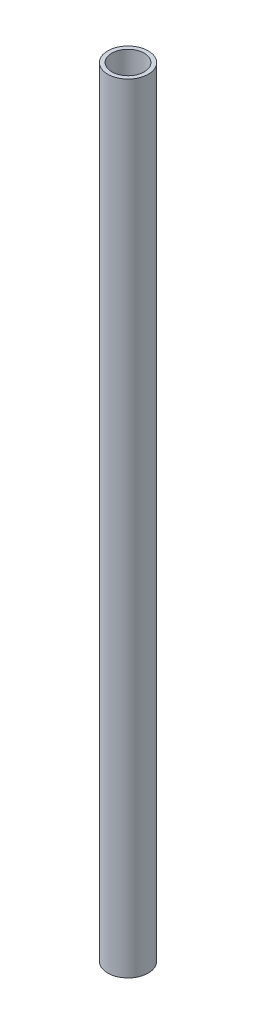
ISO-10303-21;
HEADER;
FILE_DESCRIPTION(('STEP AP214'),'2;1');
FILE_NAME('part.step','',(''),(''),'','','');
FILE_SCHEMA(('AUTOMOTIVE_DESIGN { 1 0 10303 214 1 1 1 1 }'));
ENDSEC;
DATA;
#1=APPLICATION_CONTEXT('core data for automotive mechanical design processes');
#2=APPLICATION_PROTOCOL_DEFINITION('international standard','automotive_design',2000,#1);
#3=PRODUCT_CONTEXT('',#1,'mechanical');
#4=PRODUCT('Part','Part','',(#3));
#5=PRODUCT_RELATED_PRODUCT_CATEGORY('part','',(#4));
#6=PRODUCT_DEFINITION_FORMATION('','',#4);
#7=PRODUCT_DEFINITION_CONTEXT('part definition',#1,'design');
#8=PRODUCT_DEFINITION('design','',#6,#7);
#9=PRODUCT_DEFINITION_SHAPE('','',#8);
#10=(LENGTH_UNIT() NAMED_UNIT(*) SI_UNIT(.MILLI.,.METRE.));
#11=(NAMED_UNIT(*) PLANE_ANGLE_UNIT() SI_UNIT($,.RADIAN.));
#12=(NAMED_UNIT(*) SI_UNIT($,.STERADIAN.) SOLID_ANGLE_UNIT());
#13=UNCERTAINTY_MEASURE_WITH_UNIT(LENGTH_MEASURE(1.E-05),#10,'distance_accuracy_value','');
#14=(GEOMETRIC_REPRESENTATION_CONTEXT(3) GLOBAL_UNCERTAINTY_ASSIGNED_CONTEXT((#13)) GLOBAL_UNIT_ASSIGNED_CONTEXT((#10,
#11,#12)) REPRESENTATION_CONTEXT('',''));
#15=CARTESIAN_POINT('',(0.,0.,0.));
#16=DIRECTION('',(0.,0.,1.));
#17=DIRECTION('',(1.,0.,0.));
#18=AXIS2_PLACEMENT_3D('',#15,#16,#17);
#19=CARTESIAN_POINT('',(0.,609.6,0.506202841353912));
#20=DIRECTION('',(0.,1.,0.));
#21=DIRECTION('',(0.,0.,1.));
#22=AXIS2_PLACEMENT_3D('',#19,#20,#21);
#23=PLANE('',#22);
#24=CARTESIAN_POINT('',(0.,609.6,0.506202841353912));
#25=DIRECTION('',(0.,1.,0.));
#26=DIRECTION('',(0.,0.,1.));
#27=AXIS2_PLACEMENT_3D('',#24,#25,#26);
#28=CIRCLE('',#27,15.875);
#29=CARTESIAN_POINT('',(0.,609.6,-15.3687971586461));
#30=VERTEX_POINT('',#29);
#31=EDGE_CURVE('E10',#30,#30,#28,.T.);
#32=ORIENTED_EDGE('',*,*,#31,.T.);
#33=EDGE_LOOP('',(#32));
#34=FACE_BOUND('',#33,.T.);
#35=CARTESIAN_POINT('',(0.,609.6,0.506202841353912));
#36=DIRECTION('',(0.,1.,0.));
#37=DIRECTION('',(0.,0.,1.));
#38=AXIS2_PLACEMENT_3D('',#35,#36,#37);
#39=CIRCLE('',#38,12.7);
#40=CARTESIAN_POINT('',(0.,609.6,-12.1937971586461));
#41=VERTEX_POINT('',#40);
#42=EDGE_CURVE('E46',#41,#41,#39,.T.);
#43=ORIENTED_EDGE('',*,*,#42,.F.);
#44=EDGE_LOOP('',(#43));
#45=FACE_BOUND('',#44,.T.);
#46=ADVANCED_FACE('F35',(#34,#45),#23,.T.);
#47=CARTESIAN_POINT('',(0.,0.,0.506202841353912));
#48=DIRECTION('',(0.,1.,0.));
#49=DIRECTION('',(0.,0.,1.));
#50=AXIS2_PLACEMENT_3D('',#47,#48,#49);
#51=PLANE('',#50);
#52=CARTESIAN_POINT('',(0.,0.,0.506202841353912));
#53=DIRECTION('',(0.,1.,0.));
#54=DIRECTION('',(0.,0.,1.));
#55=AXIS2_PLACEMENT_3D('',#52,#53,#54);
#56=CIRCLE('',#55,15.875);
#57=CARTESIAN_POINT('',(0.,0.,-15.3687971586461));
#58=VERTEX_POINT('',#57);
#59=EDGE_CURVE('E39',#58,#58,#56,.T.);
#60=ORIENTED_EDGE('',*,*,#59,.F.);
#61=EDGE_LOOP('',(#60));
#62=FACE_BOUND('',#61,.T.);
#63=CARTESIAN_POINT('',(0.,0.,0.506202841353912));
#64=DIRECTION('',(0.,1.,0.));
#65=DIRECTION('',(0.,0.,1.));
#66=AXIS2_PLACEMENT_3D('',#63,#64,#65);
#67=CIRCLE('',#66,12.7);
#68=CARTESIAN_POINT('',(0.,0.,-12.1937971586461));
#69=VERTEX_POINT('',#68);
#70=EDGE_CURVE('E48',#69,#69,#67,.T.);
#71=ORIENTED_EDGE('',*,*,#70,.T.);
#72=EDGE_LOOP('',(#71));
#73=FACE_BOUND('',#72,.T.);
#74=ADVANCED_FACE('F58',(#62,#73),#51,.F.);
#75=CARTESIAN_POINT('',(0.,609.6,0.506202841353912));
#76=DIRECTION('',(0.,-1.,0.));
#77=DIRECTION('',(0.,0.,-1.));
#78=AXIS2_PLACEMENT_3D('',#75,#76,#77);
#79=CYLINDRICAL_SURFACE('',#78,15.875);
#80=CARTESIAN_POINT('',(0.,609.6,-15.3687971586461));
#81=CARTESIAN_POINT('',(0.,603.25,-15.3687971586461));
#82=CARTESIAN_POINT('',(0.,596.9,-15.3687971586461));
#83=CARTESIAN_POINT('',(0.,584.2,-15.3687971586461));
#84=CARTESIAN_POINT('',(0.,577.85,-15.3687971586461));
#85=CARTESIAN_POINT('',(0.,565.15,-15.3687971586461));
#86=CARTESIAN_POINT('',(0.,558.8,-15.3687971586461));
#87=CARTESIAN_POINT('',(0.,546.1,-15.3687971586461));
#88=CARTESIAN_POINT('',(0.,539.75,-15.3687971586461));
#89=CARTESIAN_POINT('',(0.,527.05,-15.3687971586461));
#90=CARTESIAN_POINT('',(0.,520.7,-15.3687971586461));
#91=CARTESIAN_POINT('',(0.,508.,-15.3687971586461));
#92=CARTESIAN_POINT('',(0.,501.65,-15.3687971586461));
#93=CARTESIAN_POINT('',(0.,488.95,-15.3687971586461));
#94=CARTESIAN_POINT('',(0.,482.6,-15.3687971586461));
#95=CARTESIAN_POINT('',(0.,469.9,-15.3687971586461));
#96=CARTESIAN_POINT('',(0.,463.55,-15.3687971586461));
#97=CARTESIAN_POINT('',(0.,450.85,-15.3687971586461));
#98=CARTESIAN_POINT('',(0.,444.5,-15.3687971586461));
#99=CARTESIAN_POINT('',(0.,431.8,-15.3687971586461));
#100=CARTESIAN_POINT('',(0.,425.45,-15.3687971586461));
#101=CARTESIAN_POINT('',(0.,412.75,-15.3687971586461));
#102=CARTESIAN_POINT('',(0.,406.4,-15.3687971586461));
#103=CARTESIAN_POINT('',(0.,393.7,-15.3687971586461));
#104=CARTESIAN_POINT('',(0.,387.35,-15.3687971586461));
#105=CARTESIAN_POINT('',(0.,374.65,-15.3687971586461));
#106=CARTESIAN_POINT('',(0.,368.3,-15.3687971586461));
#107=CARTESIAN_POINT('',(0.,355.6,-15.3687971586461));
#108=CARTESIAN_POINT('',(0.,349.25,-15.3687971586461));
#109=CARTESIAN_POINT('',(0.,336.55,-15.3687971586461));
#110=CARTESIAN_POINT('',(0.,330.2,-15.3687971586461));
#111=CARTESIAN_POINT('',(0.,317.5,-15.3687971586461));
#112=CARTESIAN_POINT('',(0.,311.15,-15.3687971586461));
#113=CARTESIAN_POINT('',(0.,298.45,-15.3687971586461));
#114=CARTESIAN_POINT('',(0.,292.1,-15.3687971586461));
#115=CARTESIAN_POINT('',(0.,279.4,-15.3687971586461));
#116=CARTESIAN_POINT('',(0.,273.05,-15.3687971586461));
#117=CARTESIAN_POINT('',(0.,260.35,-15.3687971586461));
#118=CARTESIAN_POINT('',(0.,254.,-15.3687971586461));
#119=CARTESIAN_POINT('',(0.,241.3,-15.3687971586461));
#120=CARTESIAN_POINT('',(0.,234.95,-15.3687971586461));
#121=CARTESIAN_POINT('',(0.,222.25,-15.3687971586461));
#122=CARTESIAN_POINT('',(0.,215.9,-15.3687971586461));
#123=CARTESIAN_POINT('',(0.,203.2,-15.3687971586461));
#124=CARTESIAN_POINT('',(0.,196.85,-15.3687971586461));
#125=CARTESIAN_POINT('',(0.,184.15,-15.3687971586461));
#126=CARTESIAN_POINT('',(0.,177.8,-15.3687971586461));
#127=CARTESIAN_POINT('',(0.,165.1,-15.3687971586461));
#128=CARTESIAN_POINT('',(0.,158.75,-15.3687971586461));
#129=CARTESIAN_POINT('',(0.,146.05,-15.3687971586461));
#130=CARTESIAN_POINT('',(0.,139.7,-15.3687971586461));
#131=CARTESIAN_POINT('',(0.,127.,-15.3687971586461));
#132=CARTESIAN_POINT('',(0.,120.65,-15.3687971586461));
#133=CARTESIAN_POINT('',(0.,107.95,-15.3687971586461));
#134=CARTESIAN_POINT('',(0.,101.6,-15.3687971586461));
#135=CARTESIAN_POINT('',(0.,88.9,-15.3687971586461));
#136=CARTESIAN_POINT('',(0.,82.5500000000001,-15.3687971586461));
#137=CARTESIAN_POINT('',(0.,69.85,-15.3687971586461));
#138=CARTESIAN_POINT('',(0.,63.5,-15.3687971586461));
#139=CARTESIAN_POINT('',(0.,50.8,-15.3687971586461));
#140=CARTESIAN_POINT('',(0.,44.45,-15.3687971586461));
#141=CARTESIAN_POINT('',(0.,31.75,-15.3687971586461));
#142=CARTESIAN_POINT('',(0.,25.4,-15.3687971586461));
#143=CARTESIAN_POINT('',(0.,12.7,-15.3687971586461));
#144=CARTESIAN_POINT('',(0.,6.35000000000001,-15.3687971586461));
#145=CARTESIAN_POINT('',(0.,0.,-15.3687971586461));
#146=B_SPLINE_CURVE_WITH_KNOTS('',3,(#80,#81,#82,#83,#84,#85,#86,#87,#88,#89,#90,#91,#92,#93,
#94,#95,#96,#97,#98,#99,#100,#101,#102,#103,#104,#105,#106,#107,#108,#109,#110,#111,#112,#113,
#114,#115,#116,#117,#118,#119,#120,#121,#122,#123,#124,#125,#126,#127,#128,#129,#130,#131,#132,
#133,#134,#135,#136,#137,#138,#139,#140,#141,#142,#143,#144,#145),.UNSPECIFIED.,.F.,.F.,(4,2,2,
2,2,2,2,2,2,2,2,2,2,2,2,2,2,2,2,2,2,2,2,2,2,2,2,2,2,2,2,2,4),(0.,19.05,38.1,57.15,76.2,
95.2500000000001,114.3,133.35,152.4,171.45,190.5,209.55,228.6,247.65,266.7,285.75,304.8,323.85,
342.9,361.95,381.,400.05,419.1,438.15,457.2,476.25,495.3,514.35,533.4,552.45,571.5,590.55,
609.6),.UNSPECIFIED.);
#147=EDGE_CURVE('BSEAM37',#30,#58,#146,.T.);
#148=ORIENTED_EDGE('',*,*,#31,.F.);
#149=ORIENTED_EDGE('',*,*,#59,.T.);
#150=ORIENTED_EDGE('',*,*,#147,.T.);
#151=ORIENTED_EDGE('',*,*,#147,.F.);
#152=EDGE_LOOP('',(#148,#150,#149,#151));
#153=FACE_BOUND('',#152,.T.);
#154=ADVANCED_FACE('F37',(#153),#79,.T.);
#155=CARTESIAN_POINT('',(0.,609.6,0.506202841353912));
#156=DIRECTION('',(0.,-1.,0.));
#157=DIRECTION('',(0.,0.,-1.));
#158=AXIS2_PLACEMENT_3D('',#155,#156,#157);
#159=CYLINDRICAL_SURFACE('',#158,12.7);
#160=CARTESIAN_POINT('',(0.,609.6,-12.1937971586461));
#161=CARTESIAN_POINT('',(0.,603.25,-12.1937971586461));
#162=CARTESIAN_POINT('',(0.,596.9,-12.1937971586461));
#163=CARTESIAN_POINT('',(0.,584.2,-12.1937971586461));
#164=CARTESIAN_POINT('',(0.,577.85,-12.1937971586461));
#165=CARTESIAN_POINT('',(0.,565.15,-12.1937971586461));
#166=CARTESIAN_POINT('',(0.,558.8,-12.1937971586461));
#167=CARTESIAN_POINT('',(0.,546.1,-12.1937971586461));
#168=CARTESIAN_POINT('',(0.,539.75,-12.1937971586461));
#169=CARTESIAN_POINT('',(0.,527.05,-12.1937971586461));
#170=CARTESIAN_POINT('',(0.,520.7,-12.1937971586461));
#171=CARTESIAN_POINT('',(0.,508.,-12.1937971586461));
#172=CARTESIAN_POINT('',(0.,501.65,-12.1937971586461));
#173=CARTESIAN_POINT('',(0.,488.95,-12.1937971586461));
#174=CARTESIAN_POINT('',(0.,482.6,-12.1937971586461));
#175=CARTESIAN_POINT('',(0.,469.9,-12.1937971586461));
#176=CARTESIAN_POINT('',(0.,463.55,-12.1937971586461));
#177=CARTESIAN_POINT('',(0.,450.85,-12.1937971586461));
#178=CARTESIAN_POINT('',(0.,444.5,-12.1937971586461));
#179=CARTESIAN_POINT('',(0.,431.8,-12.1937971586461));
#180=CARTESIAN_POINT('',(0.,425.45,-12.1937971586461));
#181=CARTESIAN_POINT('',(0.,412.75,-12.1937971586461));
#182=CARTESIAN_POINT('',(0.,406.4,-12.1937971586461));
#183=CARTESIAN_POINT('',(0.,393.7,-12.1937971586461));
#184=CARTESIAN_POINT('',(0.,387.35,-12.1937971586461));
#185=CARTESIAN_POINT('',(0.,374.65,-12.1937971586461));
#186=CARTESIAN_POINT('',(0.,368.3,-12.1937971586461));
#187=CARTESIAN_POINT('',(0.,355.6,-12.1937971586461));
#188=CARTESIAN_POINT('',(0.,349.25,-12.1937971586461));
#189=CARTESIAN_POINT('',(0.,336.55,-12.1937971586461));
#190=CARTESIAN_POINT('',(0.,330.2,-12.1937971586461));
#191=CARTESIAN_POINT('',(0.,317.5,-12.1937971586461));
#192=CARTESIAN_POINT('',(0.,311.15,-12.1937971586461));
#193=CARTESIAN_POINT('',(0.,298.45,-12.1937971586461));
#194=CARTESIAN_POINT('',(0.,292.1,-12.1937971586461));
#195=CARTESIAN_POINT('',(0.,279.4,-12.1937971586461));
#196=CARTESIAN_POINT('',(0.,273.05,-12.1937971586461));
#197=CARTESIAN_POINT('',(0.,260.35,-12.1937971586461));
#198=CARTESIAN_POINT('',(0.,254.,-12.1937971586461));
#199=CARTESIAN_POINT('',(0.,241.3,-12.1937971586461));
#200=CARTESIAN_POINT('',(0.,234.95,-12.1937971586461));
#201=CARTESIAN_POINT('',(0.,222.25,-12.1937971586461));
#202=CARTESIAN_POINT('',(0.,215.9,-12.1937971586461));
#203=CARTESIAN_POINT('',(0.,203.2,-12.1937971586461));
#204=CARTESIAN_POINT('',(0.,196.85,-12.1937971586461));
#205=CARTESIAN_POINT('',(0.,184.15,-12.1937971586461));
#206=CARTESIAN_POINT('',(0.,177.8,-12.1937971586461));
#207=CARTESIAN_POINT('',(0.,165.1,-12.1937971586461));
#208=CARTESIAN_POINT('',(0.,158.75,-12.1937971586461));
#209=CARTESIAN_POINT('',(0.,146.05,-12.1937971586461));
#210=CARTESIAN_POINT('',(0.,139.7,-12.1937971586461));
#211=CARTESIAN_POINT('',(0.,127.,-12.1937971586461));
#212=CARTESIAN_POINT('',(0.,120.65,-12.1937971586461));
#213=CARTESIAN_POINT('',(0.,107.95,-12.1937971586461));
#214=CARTESIAN_POINT('',(0.,101.6,-12.1937971586461));
#215=CARTESIAN_POINT('',(0.,88.9,-12.1937971586461));
#216=CARTESIAN_POINT('',(0.,82.5500000000001,-12.1937971586461));
#217=CARTESIAN_POINT('',(0.,69.85,-12.1937971586461));
#218=CARTESIAN_POINT('',(0.,63.5,-12.1937971586461));
#219=CARTESIAN_POINT('',(0.,50.8,-12.1937971586461));
#220=CARTESIAN_POINT('',(0.,44.45,-12.1937971586461));
#221=CARTESIAN_POINT('',(0.,31.75,-12.1937971586461));
#222=CARTESIAN_POINT('',(0.,25.4,-12.1937971586461));
#223=CARTESIAN_POINT('',(0.,12.7,-12.1937971586461));
#224=CARTESIAN_POINT('',(0.,6.35000000000001,-12.1937971586461));
#225=CARTESIAN_POINT('',(0.,0.,-12.1937971586461));
#226=B_SPLINE_CURVE_WITH_KNOTS('',3,(#160,#161,#162,#163,#164,#165,#166,#167,#168,#169,#170,
#171,#172,#173,#174,#175,#176,#177,#178,#179,#180,#181,#182,#183,#184,#185,#186,#187,#188,#189,
#190,#191,#192,#193,#194,#195,#196,#197,#198,#199,#200,#201,#202,#203,#204,#205,#206,#207,#208,
#209,#210,#211,#212,#213,#214,#215,#216,#217,#218,#219,#220,#221,#222,#223,#224,#225),
.UNSPECIFIED.,.F.,.F.,(4,2,2,2,2,2,2,2,2,2,2,2,2,2,2,2,2,2,2,2,2,2,2,2,2,2,2,2,2,2,2,2,4),(0.,
19.05,38.1,57.15,76.2,95.2500000000001,114.3,133.35,152.4,171.45,190.5,209.55,228.6,247.65,
266.7,285.75,304.8,323.85,342.9,361.95,381.,400.05,419.1,438.15,457.2,476.25,495.3,514.35,533.4,
552.45,571.5,590.55,609.6),.UNSPECIFIED.);
#227=EDGE_CURVE('BSEAM54',#41,#69,#226,.T.);
#228=ORIENTED_EDGE('',*,*,#42,.T.);
#229=ORIENTED_EDGE('',*,*,#70,.F.);
#230=ORIENTED_EDGE('',*,*,#227,.T.);
#231=ORIENTED_EDGE('',*,*,#227,.F.);
#232=EDGE_LOOP('',(#228,#230,#229,#231));
#233=FACE_BOUND('',#232,.T.);
#234=ADVANCED_FACE('F54',(#233),#159,.F.);
#235=CLOSED_SHELL('',(#46,#74,#154,#234));
#236=MANIFOLD_SOLID_BREP('B2',#235);
#237=ADVANCED_BREP_SHAPE_REPRESENTATION('',(#18,#236),#14);
#238=SHAPE_DEFINITION_REPRESENTATION(#9,#237);
ENDSEC;
END-ISO-10303-21;
